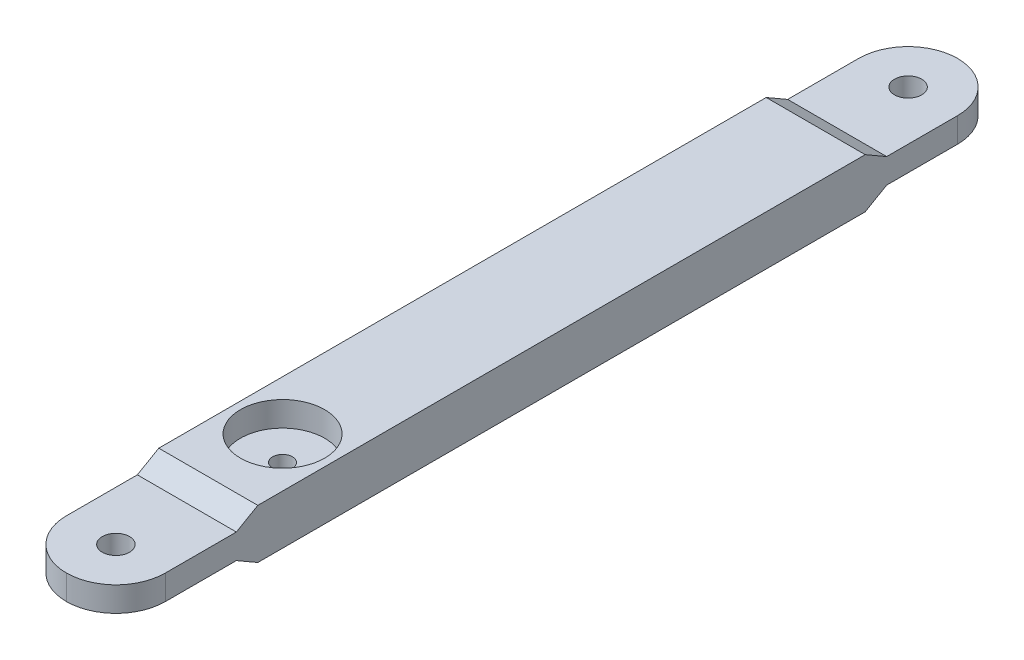
ISO-10303-21;
HEADER;
FILE_DESCRIPTION(('STEP AP214'),'2;1');
FILE_NAME('part.step','',(''),(''),'','','');
FILE_SCHEMA(('AUTOMOTIVE_DESIGN { 1 0 10303 214 1 1 1 1 }'));
ENDSEC;
DATA;
#1=APPLICATION_CONTEXT('core data for automotive mechanical design processes');
#2=APPLICATION_PROTOCOL_DEFINITION('international standard','automotive_design',2000,#1);
#3=PRODUCT_CONTEXT('',#1,'mechanical');
#4=PRODUCT('Part','Part','',(#3));
#5=PRODUCT_RELATED_PRODUCT_CATEGORY('part','',(#4));
#6=PRODUCT_DEFINITION_FORMATION('','',#4);
#7=PRODUCT_DEFINITION_CONTEXT('part definition',#1,'design');
#8=PRODUCT_DEFINITION('design','',#6,#7);
#9=PRODUCT_DEFINITION_SHAPE('','',#8);
#10=(LENGTH_UNIT() NAMED_UNIT(*) SI_UNIT(.MILLI.,.METRE.));
#11=(NAMED_UNIT(*) PLANE_ANGLE_UNIT() SI_UNIT($,.RADIAN.));
#12=(NAMED_UNIT(*) SI_UNIT($,.STERADIAN.) SOLID_ANGLE_UNIT());
#13=UNCERTAINTY_MEASURE_WITH_UNIT(LENGTH_MEASURE(1.E-05),#10,'distance_accuracy_value','');
#14=(GEOMETRIC_REPRESENTATION_CONTEXT(3) GLOBAL_UNCERTAINTY_ASSIGNED_CONTEXT((#13)) GLOBAL_UNIT_ASSIGNED_CONTEXT((#10,
#11,#12)) REPRESENTATION_CONTEXT('',''));
#15=CARTESIAN_POINT('',(0.,0.,0.));
#16=DIRECTION('',(0.,0.,1.));
#17=DIRECTION('',(1.,0.,0.));
#18=AXIS2_PLACEMENT_3D('',#15,#16,#17);
#19=CARTESIAN_POINT('',(-10.,-5.,-70.));
#20=DIRECTION('',(-1.,0.,0.));
#21=DIRECTION('',(0.,0.,1.));
#22=AXIS2_PLACEMENT_3D('',#19,#20,#21);
#23=PLANE('',#22);
#24=DIRECTION('',(0.,0.,-1.));
#25=VECTOR('',#24,1.);
#26=CARTESIAN_POINT('',(-10.,2.5,90.));
#27=LINE('',#26,#25);
#28=CARTESIAN_POINT('',(-10.,2.5,80.));
#29=VERTEX_POINT('',#28);
#30=CARTESIAN_POINT('',(-10.,2.5,65.6698729810777));
#31=VERTEX_POINT('',#30);
#32=EDGE_CURVE('E318',#29,#31,#27,.T.);
#33=ORIENTED_EDGE('',*,*,#32,.T.);
#34=DIRECTION('',(0.,0.499999999999997,-0.866025403784441));
#35=VECTOR('',#34,1.);
#36=CARTESIAN_POINT('',(-10.,59.3717782649104,-32.8349364905394));
#37=LINE('',#36,#35);
#38=CARTESIAN_POINT('',(-10.,5.,61.3397459621554));
#39=VERTEX_POINT('',#38);
#40=EDGE_CURVE('E231',#31,#39,#37,.T.);
#41=ORIENTED_EDGE('',*,*,#40,.T.);
#42=DIRECTION('',(0.,0.,1.));
#43=VECTOR('',#42,1.);
#44=CARTESIAN_POINT('',(-10.,5.,-70.));
#45=LINE('',#44,#43);
#46=CARTESIAN_POINT('',(-10.,5.,-61.3397459621554));
#47=VERTEX_POINT('',#46);
#48=EDGE_CURVE('E168',#47,#39,#45,.T.);
#49=ORIENTED_EDGE('',*,*,#48,.F.);
#50=DIRECTION('',(0.,0.499999999999997,0.866025403784441));
#51=VECTOR('',#50,1.);
#52=CARTESIAN_POINT('',(-10.,-1.25000000000003,-72.1650635094611));
#53=LINE('',#52,#51);
#54=CARTESIAN_POINT('',(-10.,2.5,-65.6698729810777));
#55=VERTEX_POINT('',#54);
#56=EDGE_CURVE('E210',#47,#55,#53,.F.);
#57=ORIENTED_EDGE('',*,*,#56,.T.);
#58=DIRECTION('',(0.,0.,1.));
#59=VECTOR('',#58,1.);
#60=CARTESIAN_POINT('',(-10.,2.5,-90.));
#61=LINE('',#60,#59);
#62=CARTESIAN_POINT('',(-10.,2.5,-80.));
#63=VERTEX_POINT('',#62);
#64=EDGE_CURVE('E160',#63,#55,#61,.T.);
#65=ORIENTED_EDGE('',*,*,#64,.F.);
#66=DIRECTION('',(0.,1.,0.));
#67=VECTOR('',#66,1.);
#68=CARTESIAN_POINT('',(-10.,-5.,-80.));
#69=LINE('',#68,#67);
#70=CARTESIAN_POINT('',(-10.,-2.5,-80.));
#71=VERTEX_POINT('',#70);
#72=EDGE_CURVE('E172',#63,#71,#69,.F.);
#73=ORIENTED_EDGE('',*,*,#72,.T.);
#74=DIRECTION('',(0.,0.,1.));
#75=VECTOR('',#74,1.);
#76=CARTESIAN_POINT('',(-10.,-2.5,-90.));
#77=LINE('',#76,#75);
#78=CARTESIAN_POINT('',(-10.,-2.5,-65.6698729810777));
#79=VERTEX_POINT('',#78);
#80=EDGE_CURVE('E274',#71,#79,#77,.T.);
#81=ORIENTED_EDGE('',*,*,#80,.T.);
#82=DIRECTION('',(0.,0.499999999999997,-0.866025403784441));
#83=VECTOR('',#82,1.);
#84=CARTESIAN_POINT('',(-10.,-1.24999999999994,-67.8349364905389));
#85=LINE('',#84,#83);
#86=CARTESIAN_POINT('',(-10.,-5.,-61.3397459621554));
#87=VERTEX_POINT('',#86);
#88=EDGE_CURVE('E224',#79,#87,#85,.F.);
#89=ORIENTED_EDGE('',*,*,#88,.T.);
#90=DIRECTION('',(0.,0.,1.));
#91=VECTOR('',#90,1.);
#92=CARTESIAN_POINT('',(-10.,-5.,-70.));
#93=LINE('',#92,#91);
#94=CARTESIAN_POINT('',(-10.,-5.,61.3397459621554));
#95=VERTEX_POINT('',#94);
#96=EDGE_CURVE('E178',#87,#95,#93,.T.);
#97=ORIENTED_EDGE('',*,*,#96,.T.);
#98=DIRECTION('',(0.,0.499999999999997,0.866025403784441));
#99=VECTOR('',#98,1.);
#100=CARTESIAN_POINT('',(-10.,-61.8717782649104,-37.1650635094616));
#101=LINE('',#100,#99);
#102=CARTESIAN_POINT('',(-10.,-2.5,65.6698729810777));
#103=VERTEX_POINT('',#102);
#104=EDGE_CURVE('E227',#95,#103,#101,.T.);
#105=ORIENTED_EDGE('',*,*,#104,.T.);
#106=DIRECTION('',(0.,0.,-1.));
#107=VECTOR('',#106,1.);
#108=CARTESIAN_POINT('',(-10.,-2.5,90.));
#109=LINE('',#108,#107);
#110=CARTESIAN_POINT('',(-10.,-2.5,80.));
#111=VERTEX_POINT('',#110);
#112=EDGE_CURVE('E321',#111,#103,#109,.T.);
#113=ORIENTED_EDGE('',*,*,#112,.F.);
#114=DIRECTION('',(0.,1.,0.));
#115=VECTOR('',#114,1.);
#116=CARTESIAN_POINT('',(-10.,-5.,80.));
#117=LINE('',#116,#115);
#118=EDGE_CURVE('E149',#111,#29,#117,.T.);
#119=ORIENTED_EDGE('',*,*,#118,.T.);
#120=EDGE_LOOP('',(#33,#41,#49,#57,#65,#73,#81,#89,#97,#105,#113,#119));
#121=FACE_BOUND('',#120,.T.);
#122=ADVANCED_FACE('F38',(#121),#23,.T.);
#123=CARTESIAN_POINT('',(-10.,5.,-70.));
#124=DIRECTION('',(0.,1.,0.));
#125=DIRECTION('',(0.,0.,1.));
#126=AXIS2_PLACEMENT_3D('',#123,#124,#125);
#127=PLANE('',#126);
#128=CARTESIAN_POINT('',(0.,5.,46.3397459621554));
#129=DIRECTION('',(0.,1.,0.));
#130=DIRECTION('',(0.,0.,1.));
#131=AXIS2_PLACEMENT_3D('',#128,#129,#130);
#132=CIRCLE('',#131,8.5);
#133=CARTESIAN_POINT('',(0.,5.,54.8397459621554));
#134=VERTEX_POINT('',#133);
#135=EDGE_CURVE('E330',#134,#134,#132,.T.);
#136=ORIENTED_EDGE('',*,*,#135,.F.);
#137=EDGE_LOOP('',(#136));
#138=FACE_BOUND('',#137,.T.);
#139=ORIENTED_EDGE('',*,*,#48,.T.);
#140=DIRECTION('',(1.,0.,0.));
#141=VECTOR('',#140,1.);
#142=CARTESIAN_POINT('',(10.,5.,61.3397459621554));
#143=LINE('',#142,#141);
#144=CARTESIAN_POINT('',(10.,5.,61.3397459621554));
#145=VERTEX_POINT('',#144);
#146=EDGE_CURVE('E238',#39,#145,#143,.T.);
#147=ORIENTED_EDGE('',*,*,#146,.T.);
#148=DIRECTION('',(0.,0.,1.));
#149=VECTOR('',#148,1.);
#150=CARTESIAN_POINT('',(10.,5.,-70.));
#151=LINE('',#150,#149);
#152=CARTESIAN_POINT('',(10.,5.,-61.3397459621554));
#153=VERTEX_POINT('',#152);
#154=EDGE_CURVE('E175',#153,#145,#151,.T.);
#155=ORIENTED_EDGE('',*,*,#154,.F.);
#156=DIRECTION('',(-1.,0.,0.));
#157=VECTOR('',#156,1.);
#158=CARTESIAN_POINT('',(-10.,5.,-61.3397459621554));
#159=LINE('',#158,#157);
#160=EDGE_CURVE('E234',#153,#47,#159,.T.);
#161=ORIENTED_EDGE('',*,*,#160,.T.);
#162=EDGE_LOOP('',(#139,#147,#155,#161));
#163=FACE_BOUND('',#162,.T.);
#164=ADVANCED_FACE('F301',(#138,#163),#127,.T.);
#165=CARTESIAN_POINT('',(10.,-5.,-70.));
#166=DIRECTION('',(1.,0.,0.));
#167=DIRECTION('',(0.,0.,-1.));
#168=AXIS2_PLACEMENT_3D('',#165,#166,#167);
#169=PLANE('',#168);
#170=DIRECTION('',(0.,-0.499999999999997,0.866025403784441));
#171=VECTOR('',#170,1.);
#172=CARTESIAN_POINT('',(10.,59.3717782649104,-32.8349364905394));
#173=LINE('',#172,#171);
#174=CARTESIAN_POINT('',(10.,2.5,65.6698729810777));
#175=VERTEX_POINT('',#174);
#176=EDGE_CURVE('E251',#145,#175,#173,.T.);
#177=ORIENTED_EDGE('',*,*,#176,.T.);
#178=DIRECTION('',(0.,0.,-1.));
#179=VECTOR('',#178,1.);
#180=CARTESIAN_POINT('',(10.,2.5,90.));
#181=LINE('',#180,#179);
#182=CARTESIAN_POINT('',(10.,2.5,80.));
#183=VERTEX_POINT('',#182);
#184=EDGE_CURVE('E57',#183,#175,#181,.T.);
#185=ORIENTED_EDGE('',*,*,#184,.F.);
#186=DIRECTION('',(0.,-1.,0.));
#187=VECTOR('',#186,1.);
#188=CARTESIAN_POINT('',(10.,-5.,80.));
#189=LINE('',#188,#187);
#190=CARTESIAN_POINT('',(10.,-2.5,80.));
#191=VERTEX_POINT('',#190);
#192=EDGE_CURVE('E207',#183,#191,#189,.T.);
#193=ORIENTED_EDGE('',*,*,#192,.T.);
#194=DIRECTION('',(0.,0.,-1.));
#195=VECTOR('',#194,1.);
#196=CARTESIAN_POINT('',(10.,-2.5,90.));
#197=LINE('',#196,#195);
#198=CARTESIAN_POINT('',(10.,-2.5,65.6698729810777));
#199=VERTEX_POINT('',#198);
#200=EDGE_CURVE('E215',#191,#199,#197,.T.);
#201=ORIENTED_EDGE('',*,*,#200,.T.);
#202=DIRECTION('',(0.,-0.499999999999997,-0.866025403784441));
#203=VECTOR('',#202,1.);
#204=CARTESIAN_POINT('',(10.,-61.8717782649104,-37.1650635094616));
#205=LINE('',#204,#203);
#206=CARTESIAN_POINT('',(10.,-5.,61.3397459621554));
#207=VERTEX_POINT('',#206);
#208=EDGE_CURVE('E248',#199,#207,#205,.T.);
#209=ORIENTED_EDGE('',*,*,#208,.T.);
#210=DIRECTION('',(0.,0.,1.));
#211=VECTOR('',#210,1.);
#212=CARTESIAN_POINT('',(10.,-5.,-70.));
#213=LINE('',#212,#211);
#214=CARTESIAN_POINT('',(10.,-5.,-61.3397459621554));
#215=VERTEX_POINT('',#214);
#216=EDGE_CURVE('E287',#215,#207,#213,.T.);
#217=ORIENTED_EDGE('',*,*,#216,.F.);
#218=DIRECTION('',(0.,-0.499999999999997,0.866025403784441));
#219=VECTOR('',#218,1.);
#220=CARTESIAN_POINT('',(10.,-1.24999999999994,-67.8349364905389));
#221=LINE('',#220,#219);
#222=CARTESIAN_POINT('',(10.,-2.5,-65.6698729810777));
#223=VERTEX_POINT('',#222);
#224=EDGE_CURVE('E245',#215,#223,#221,.F.);
#225=ORIENTED_EDGE('',*,*,#224,.T.);
#226=DIRECTION('',(0.,0.,1.));
#227=VECTOR('',#226,1.);
#228=CARTESIAN_POINT('',(10.,-2.5,-90.));
#229=LINE('',#228,#227);
#230=CARTESIAN_POINT('',(10.,-2.5,-80.));
#231=VERTEX_POINT('',#230);
#232=EDGE_CURVE('E74',#231,#223,#229,.T.);
#233=ORIENTED_EDGE('',*,*,#232,.F.);
#234=DIRECTION('',(0.,-1.,0.));
#235=VECTOR('',#234,1.);
#236=CARTESIAN_POINT('',(10.,-5.,-80.));
#237=LINE('',#236,#235);
#238=CARTESIAN_POINT('',(10.,2.5,-80.));
#239=VERTEX_POINT('',#238);
#240=EDGE_CURVE('E143',#231,#239,#237,.F.);
#241=ORIENTED_EDGE('',*,*,#240,.T.);
#242=DIRECTION('',(0.,0.,1.));
#243=VECTOR('',#242,1.);
#244=CARTESIAN_POINT('',(10.,2.5,-90.));
#245=LINE('',#244,#243);
#246=CARTESIAN_POINT('',(10.,2.5,-65.6698729810777));
#247=VERTEX_POINT('',#246);
#248=EDGE_CURVE('E82',#239,#247,#245,.T.);
#249=ORIENTED_EDGE('',*,*,#248,.T.);
#250=DIRECTION('',(0.,-0.499999999999997,-0.866025403784441));
#251=VECTOR('',#250,1.);
#252=CARTESIAN_POINT('',(10.,-1.25000000000003,-72.1650635094611));
#253=LINE('',#252,#251);
#254=EDGE_CURVE('E242',#247,#153,#253,.F.);
#255=ORIENTED_EDGE('',*,*,#254,.T.);
#256=ORIENTED_EDGE('',*,*,#154,.T.);
#257=EDGE_LOOP('',(#177,#185,#193,#201,#209,#217,#225,#233,#241,#249,#255,#256));
#258=FACE_BOUND('',#257,.T.);
#259=ADVANCED_FACE('F144',(#258),#169,.T.);
#260=CARTESIAN_POINT('',(-10.,-5.,-70.));
#261=DIRECTION('',(0.,-1.,0.));
#262=DIRECTION('',(0.,0.,-1.));
#263=AXIS2_PLACEMENT_3D('',#260,#261,#262);
#264=PLANE('',#263);
#265=CARTESIAN_POINT('',(0.,-5.,46.3397459621554));
#266=DIRECTION('',(0.,1.,0.));
#267=DIRECTION('',(0.,0.,1.));
#268=AXIS2_PLACEMENT_3D('',#265,#266,#267);
#269=CIRCLE('',#268,2.);
#270=CARTESIAN_POINT('',(0.,-5.,48.3397459621554));
#271=VERTEX_POINT('',#270);
#272=EDGE_CURVE('E337',#271,#271,#269,.T.);
#273=ORIENTED_EDGE('',*,*,#272,.T.);
#274=EDGE_LOOP('',(#273));
#275=FACE_BOUND('',#274,.T.);
#276=ORIENTED_EDGE('',*,*,#216,.T.);
#277=DIRECTION('',(-1.,0.,0.));
#278=VECTOR('',#277,1.);
#279=CARTESIAN_POINT('',(-10.,-5.,61.3397459621554));
#280=LINE('',#279,#278);
#281=EDGE_CURVE('E258',#207,#95,#280,.T.);
#282=ORIENTED_EDGE('',*,*,#281,.T.);
#283=ORIENTED_EDGE('',*,*,#96,.F.);
#284=DIRECTION('',(1.,0.,0.));
#285=VECTOR('',#284,1.);
#286=CARTESIAN_POINT('',(-10.,-5.,-61.3397459621554));
#287=LINE('',#286,#285);
#288=EDGE_CURVE('E254',#87,#215,#287,.T.);
#289=ORIENTED_EDGE('',*,*,#288,.T.);
#290=EDGE_LOOP('',(#276,#282,#283,#289));
#291=FACE_BOUND('',#290,.T.);
#292=ADVANCED_FACE('F283',(#275,#291),#264,.T.);
#293=CARTESIAN_POINT('',(10.,-2.5,-90.));
#294=DIRECTION('',(0.,1.,0.));
#295=DIRECTION('',(0.,0.,1.));
#296=AXIS2_PLACEMENT_3D('',#293,#294,#295);
#297=PLANE('',#296);
#298=CARTESIAN_POINT('',(0.,-2.5,-80.));
#299=DIRECTION('',(0.,1.,0.));
#300=DIRECTION('',(0.,0.,1.));
#301=AXIS2_PLACEMENT_3D('',#298,#299,#300);
#302=CIRCLE('',#301,2.75);
#303=CARTESIAN_POINT('',(0.,-2.5,-77.25));
#304=VERTEX_POINT('',#303);
#305=EDGE_CURVE('E191',#304,#304,#302,.T.);
#306=ORIENTED_EDGE('',*,*,#305,.T.);
#307=EDGE_LOOP('',(#306));
#308=FACE_BOUND('',#307,.T.);
#309=ORIENTED_EDGE('',*,*,#80,.F.);
#310=CARTESIAN_POINT('',(0.,-2.5,-80.));
#311=DIRECTION('',(0.,1.,0.));
#312=DIRECTION('',(0.,0.,1.));
#313=AXIS2_PLACEMENT_3D('',#310,#311,#312);
#314=CIRCLE('',#313,10.);
#315=CARTESIAN_POINT('',(0.,-2.5,-90.));
#316=VERTEX_POINT('',#315);
#317=EDGE_CURVE('E150',#71,#316,#314,.F.);
#318=ORIENTED_EDGE('',*,*,#317,.T.);
#319=CARTESIAN_POINT('',(0.,-2.5,-80.));
#320=DIRECTION('',(0.,1.,0.));
#321=DIRECTION('',(0.,0.,1.));
#322=AXIS2_PLACEMENT_3D('',#319,#320,#321);
#323=CIRCLE('',#322,10.);
#324=EDGE_CURVE('E184',#316,#231,#323,.F.);
#325=ORIENTED_EDGE('',*,*,#324,.T.);
#326=ORIENTED_EDGE('',*,*,#232,.T.);
#327=DIRECTION('',(1.,0.,0.));
#328=VECTOR('',#327,1.);
#329=CARTESIAN_POINT('',(10.,-2.5,-65.6698729810777));
#330=LINE('',#329,#328);
#331=EDGE_CURVE('E49',#223,#79,#330,.F.);
#332=ORIENTED_EDGE('',*,*,#331,.T.);
#333=EDGE_LOOP('',(#309,#318,#325,#326,#332));
#334=FACE_BOUND('',#333,.T.);
#335=ADVANCED_FACE('F273',(#308,#334),#297,.F.);
#336=CARTESIAN_POINT('',(10.,2.5,-90.));
#337=DIRECTION('',(0.,-1.,0.));
#338=DIRECTION('',(0.,0.,-1.));
#339=AXIS2_PLACEMENT_3D('',#336,#337,#338);
#340=PLANE('',#339);
#341=CARTESIAN_POINT('',(0.,2.5,-80.));
#342=DIRECTION('',(0.,1.,0.));
#343=DIRECTION('',(0.,0.,1.));
#344=AXIS2_PLACEMENT_3D('',#341,#342,#343);
#345=CIRCLE('',#344,2.75);
#346=CARTESIAN_POINT('',(0.,2.5,-77.25));
#347=VERTEX_POINT('',#346);
#348=EDGE_CURVE('E312',#347,#347,#345,.T.);
#349=ORIENTED_EDGE('',*,*,#348,.F.);
#350=EDGE_LOOP('',(#349));
#351=FACE_BOUND('',#350,.T.);
#352=CARTESIAN_POINT('',(0.,2.5,-80.));
#353=DIRECTION('',(0.,-1.,0.));
#354=DIRECTION('',(0.,0.,-1.));
#355=AXIS2_PLACEMENT_3D('',#352,#353,#354);
#356=CIRCLE('',#355,10.);
#357=CARTESIAN_POINT('',(0.,2.5,-90.));
#358=VERTEX_POINT('',#357);
#359=EDGE_CURVE('E154',#239,#358,#356,.F.);
#360=ORIENTED_EDGE('',*,*,#359,.T.);
#361=CARTESIAN_POINT('',(0.,2.5,-80.));
#362=DIRECTION('',(0.,-1.,0.));
#363=DIRECTION('',(0.,0.,-1.));
#364=AXIS2_PLACEMENT_3D('',#361,#362,#363);
#365=CIRCLE('',#364,10.);
#366=EDGE_CURVE('E167',#358,#63,#365,.F.);
#367=ORIENTED_EDGE('',*,*,#366,.T.);
#368=ORIENTED_EDGE('',*,*,#64,.T.);
#369=DIRECTION('',(-1.,0.,0.));
#370=VECTOR('',#369,1.);
#371=CARTESIAN_POINT('',(10.,2.5,-65.6698729810777));
#372=LINE('',#371,#370);
#373=EDGE_CURVE('E11',#55,#247,#372,.F.);
#374=ORIENTED_EDGE('',*,*,#373,.T.);
#375=ORIENTED_EDGE('',*,*,#248,.F.);
#376=EDGE_LOOP('',(#360,#367,#368,#374,#375));
#377=FACE_BOUND('',#376,.T.);
#378=ADVANCED_FACE('F153',(#351,#377),#340,.F.);
#379=CARTESIAN_POINT('',(0.,0.,-80.));
#380=DIRECTION('',(0.,-1.,0.));
#381=DIRECTION('',(0.,0.,-1.));
#382=AXIS2_PLACEMENT_3D('',#379,#380,#381);
#383=CYLINDRICAL_SURFACE('',#382,10.);
#384=ORIENTED_EDGE('',*,*,#240,.F.);
#385=ORIENTED_EDGE('',*,*,#324,.F.);
#386=DIRECTION('',(0.,-1.,0.));
#387=VECTOR('',#386,1.);
#388=CARTESIAN_POINT('',(0.,0.,-90.));
#389=LINE('',#388,#387);
#390=EDGE_CURVE('E161',#358,#316,#389,.T.);
#391=ORIENTED_EDGE('',*,*,#390,.F.);
#392=ORIENTED_EDGE('',*,*,#359,.F.);
#393=EDGE_LOOP('',(#384,#385,#391,#392));
#394=FACE_BOUND('',#393,.T.);
#395=ADVANCED_FACE('F163',(#394),#383,.T.);
#396=CARTESIAN_POINT('',(0.,0.,-80.));
#397=DIRECTION('',(0.,1.,0.));
#398=DIRECTION('',(0.,0.,1.));
#399=AXIS2_PLACEMENT_3D('',#396,#397,#398);
#400=CYLINDRICAL_SURFACE('',#399,10.);
#401=ORIENTED_EDGE('',*,*,#317,.F.);
#402=ORIENTED_EDGE('',*,*,#72,.F.);
#403=ORIENTED_EDGE('',*,*,#366,.F.);
#404=ORIENTED_EDGE('',*,*,#390,.T.);
#405=EDGE_LOOP('',(#401,#402,#403,#404));
#406=FACE_BOUND('',#405,.T.);
#407=ADVANCED_FACE('F376',(#406),#400,.T.);
#408=CARTESIAN_POINT('',(0.,-5.,-80.));
#409=DIRECTION('',(0.,1.,0.));
#410=DIRECTION('',(0.,0.,1.));
#411=AXIS2_PLACEMENT_3D('',#408,#409,#410);
#412=CYLINDRICAL_SURFACE('',#411,2.75);
#413=CARTESIAN_POINT('',(0.,2.5,-77.25));
#414=CARTESIAN_POINT('',(0.,2.44791666666667,-77.25));
#415=CARTESIAN_POINT('',(0.,2.39583333333333,-77.25));
#416=CARTESIAN_POINT('',(0.,2.29166666666667,-77.25));
#417=CARTESIAN_POINT('',(0.,2.23958333333333,-77.25));
#418=CARTESIAN_POINT('',(0.,2.13541666666667,-77.25));
#419=CARTESIAN_POINT('',(0.,2.08333333333333,-77.25));
#420=CARTESIAN_POINT('',(0.,1.97916666666667,-77.25));
#421=CARTESIAN_POINT('',(0.,1.92708333333333,-77.25));
#422=CARTESIAN_POINT('',(0.,1.82291666666667,-77.25));
#423=CARTESIAN_POINT('',(0.,1.77083333333333,-77.25));
#424=CARTESIAN_POINT('',(0.,1.66666666666667,-77.25));
#425=CARTESIAN_POINT('',(0.,1.61458333333333,-77.25));
#426=CARTESIAN_POINT('',(0.,1.51041666666667,-77.25));
#427=CARTESIAN_POINT('',(0.,1.45833333333333,-77.25));
#428=CARTESIAN_POINT('',(0.,1.35416666666667,-77.25));
#429=CARTESIAN_POINT('',(0.,1.30208333333333,-77.25));
#430=CARTESIAN_POINT('',(0.,1.19791666666667,-77.25));
#431=CARTESIAN_POINT('',(0.,1.14583333333333,-77.25));
#432=CARTESIAN_POINT('',(0.,1.04166666666667,-77.25));
#433=CARTESIAN_POINT('',(0.,0.989583333333333,-77.25));
#434=CARTESIAN_POINT('',(0.,0.885416666666667,-77.25));
#435=CARTESIAN_POINT('',(0.,0.833333333333333,-77.25));
#436=CARTESIAN_POINT('',(0.,0.729166666666667,-77.25));
#437=CARTESIAN_POINT('',(0.,0.677083333333333,-77.25));
#438=CARTESIAN_POINT('',(0.,0.572916666666666,-77.25));
#439=CARTESIAN_POINT('',(0.,0.520833333333333,-77.25));
#440=CARTESIAN_POINT('',(0.,0.416666666666666,-77.25));
#441=CARTESIAN_POINT('',(0.,0.364583333333333,-77.25));
#442=CARTESIAN_POINT('',(0.,0.260416666666667,-77.25));
#443=CARTESIAN_POINT('',(0.,0.208333333333334,-77.25));
#444=CARTESIAN_POINT('',(0.,0.104166666666667,-77.25));
#445=CARTESIAN_POINT('',(0.,0.0520833333333334,-77.25));
#446=CARTESIAN_POINT('',(0.,-0.0520833333333334,-77.25));
#447=CARTESIAN_POINT('',(0.,-0.104166666666667,-77.25));
#448=CARTESIAN_POINT('',(0.,-0.208333333333334,-77.25));
#449=CARTESIAN_POINT('',(0.,-0.260416666666667,-77.25));
#450=CARTESIAN_POINT('',(0.,-0.364583333333334,-77.25));
#451=CARTESIAN_POINT('',(0.,-0.416666666666667,-77.25));
#452=CARTESIAN_POINT('',(0.,-0.520833333333334,-77.25));
#453=CARTESIAN_POINT('',(0.,-0.572916666666667,-77.25));
#454=CARTESIAN_POINT('',(0.,-0.677083333333334,-77.25));
#455=CARTESIAN_POINT('',(0.,-0.729166666666667,-77.25));
#456=CARTESIAN_POINT('',(0.,-0.833333333333334,-77.25));
#457=CARTESIAN_POINT('',(0.,-0.885416666666668,-77.25));
#458=CARTESIAN_POINT('',(0.,-0.989583333333334,-77.25));
#459=CARTESIAN_POINT('',(0.,-1.04166666666667,-77.25));
#460=CARTESIAN_POINT('',(0.,-1.14583333333333,-77.25));
#461=CARTESIAN_POINT('',(0.,-1.19791666666667,-77.25));
#462=CARTESIAN_POINT('',(0.,-1.30208333333333,-77.25));
#463=CARTESIAN_POINT('',(0.,-1.35416666666667,-77.25));
#464=CARTESIAN_POINT('',(0.,-1.45833333333333,-77.25));
#465=CARTESIAN_POINT('',(0.,-1.51041666666667,-77.25));
#466=CARTESIAN_POINT('',(0.,-1.61458333333333,-77.25));
#467=CARTESIAN_POINT('',(0.,-1.66666666666667,-77.25));
#468=CARTESIAN_POINT('',(0.,-1.77083333333333,-77.25));
#469=CARTESIAN_POINT('',(0.,-1.82291666666667,-77.25));
#470=CARTESIAN_POINT('',(0.,-1.92708333333333,-77.25));
#471=CARTESIAN_POINT('',(0.,-1.97916666666667,-77.25));
#472=CARTESIAN_POINT('',(0.,-2.08333333333333,-77.25));
#473=CARTESIAN_POINT('',(0.,-2.13541666666667,-77.25));
#474=CARTESIAN_POINT('',(0.,-2.23958333333333,-77.25));
#475=CARTESIAN_POINT('',(0.,-2.29166666666667,-77.25));
#476=CARTESIAN_POINT('',(0.,-2.39583333333333,-77.25));
#477=CARTESIAN_POINT('',(0.,-2.44791666666667,-77.25));
#478=CARTESIAN_POINT('',(0.,-2.5,-77.25));
#479=B_SPLINE_CURVE_WITH_KNOTS('',3,(#413,#414,#415,#416,#417,#418,#419,#420,#421,#422,#423,
#424,#425,#426,#427,#428,#429,#430,#431,#432,#433,#434,#435,#436,#437,#438,#439,#440,#441,#442,
#443,#444,#445,#446,#447,#448,#449,#450,#451,#452,#453,#454,#455,#456,#457,#458,#459,#460,#461,
#462,#463,#464,#465,#466,#467,#468,#469,#470,#471,#472,#473,#474,#475,#476,#477,#478),
.UNSPECIFIED.,.F.,.F.,(4,2,2,2,2,2,2,2,2,2,2,2,2,2,2,2,2,2,2,2,2,2,2,2,2,2,2,2,2,2,2,2,4),(0.,
0.15625,0.3125,0.46875,0.625000000000001,0.781250000000001,0.937500000000001,1.09375,1.25,
1.40625,1.5625,1.71875,1.875,2.03125,2.1875,2.34375,2.5,2.65625,2.8125,2.96875,3.125,3.28125,
3.4375,3.59375,3.75,3.90625,4.0625,4.21875,4.375,4.53125,4.6875,4.84375,5.),.UNSPECIFIED.);
#480=EDGE_CURVE('BSEAM379',#347,#304,#479,.T.);
#481=ORIENTED_EDGE('',*,*,#348,.T.);
#482=ORIENTED_EDGE('',*,*,#305,.F.);
#483=ORIENTED_EDGE('',*,*,#480,.T.);
#484=ORIENTED_EDGE('',*,*,#480,.F.);
#485=EDGE_LOOP('',(#481,#483,#482,#484));
#486=FACE_BOUND('',#485,.T.);
#487=ADVANCED_FACE('F379',(#486),#412,.F.);
#488=CARTESIAN_POINT('',(10.,2.5,90.));
#489=DIRECTION('',(0.,1.,0.));
#490=DIRECTION('',(0.,0.,1.));
#491=AXIS2_PLACEMENT_3D('',#488,#489,#490);
#492=PLANE('',#491);
#493=CARTESIAN_POINT('',(0.,2.5,80.));
#494=DIRECTION('',(0.,-1.,0.));
#495=DIRECTION('',(0.,0.,-1.));
#496=AXIS2_PLACEMENT_3D('',#493,#494,#495);
#497=CIRCLE('',#496,2.75);
#498=CARTESIAN_POINT('',(0.,2.5,82.75));
#499=VERTEX_POINT('',#498);
#500=EDGE_CURVE('E220',#499,#499,#497,.T.);
#501=ORIENTED_EDGE('',*,*,#500,.T.);
#502=EDGE_LOOP('',(#501));
#503=FACE_BOUND('',#502,.T.);
#504=ORIENTED_EDGE('',*,*,#32,.F.);
#505=CARTESIAN_POINT('',(0.,2.5,80.));
#506=DIRECTION('',(0.,1.,0.));
#507=DIRECTION('',(0.,0.,1.));
#508=AXIS2_PLACEMENT_3D('',#505,#506,#507);
#509=CIRCLE('',#508,10.);
#510=CARTESIAN_POINT('',(0.,2.5,90.));
#511=VERTEX_POINT('',#510);
#512=EDGE_CURVE('E198',#29,#511,#509,.T.);
#513=ORIENTED_EDGE('',*,*,#512,.T.);
#514=CARTESIAN_POINT('',(0.,2.5,80.));
#515=DIRECTION('',(0.,1.,0.));
#516=DIRECTION('',(0.,0.,1.));
#517=AXIS2_PLACEMENT_3D('',#514,#515,#516);
#518=CIRCLE('',#517,10.);
#519=EDGE_CURVE('E195',#511,#183,#518,.T.);
#520=ORIENTED_EDGE('',*,*,#519,.T.);
#521=ORIENTED_EDGE('',*,*,#184,.T.);
#522=DIRECTION('',(-1.,0.,0.));
#523=VECTOR('',#522,1.);
#524=CARTESIAN_POINT('',(0.,2.5,65.6698729810777));
#525=LINE('',#524,#523);
#526=EDGE_CURVE('E262',#175,#31,#525,.T.);
#527=ORIENTED_EDGE('',*,*,#526,.T.);
#528=EDGE_LOOP('',(#504,#513,#520,#521,#527));
#529=FACE_BOUND('',#528,.T.);
#530=ADVANCED_FACE('F468',(#503,#529),#492,.T.);
#531=CARTESIAN_POINT('',(10.,-2.5,90.));
#532=DIRECTION('',(0.,-1.,0.));
#533=DIRECTION('',(0.,0.,-1.));
#534=AXIS2_PLACEMENT_3D('',#531,#532,#533);
#535=PLANE('',#534);
#536=CARTESIAN_POINT('',(0.,-2.5,80.));
#537=DIRECTION('',(0.,-1.,0.));
#538=DIRECTION('',(0.,0.,-1.));
#539=AXIS2_PLACEMENT_3D('',#536,#537,#538);
#540=CIRCLE('',#539,2.75);
#541=CARTESIAN_POINT('',(0.,-2.5,82.75));
#542=VERTEX_POINT('',#541);
#543=EDGE_CURVE('E216',#542,#542,#540,.F.);
#544=ORIENTED_EDGE('',*,*,#543,.T.);
#545=EDGE_LOOP('',(#544));
#546=FACE_BOUND('',#545,.T.);
#547=CARTESIAN_POINT('',(0.,-2.5,80.));
#548=DIRECTION('',(0.,-1.,0.));
#549=DIRECTION('',(0.,0.,-1.));
#550=AXIS2_PLACEMENT_3D('',#547,#548,#549);
#551=CIRCLE('',#550,10.);
#552=CARTESIAN_POINT('',(0.,-2.5,90.));
#553=VERTEX_POINT('',#552);
#554=EDGE_CURVE('E201',#191,#553,#551,.T.);
#555=ORIENTED_EDGE('',*,*,#554,.T.);
#556=CARTESIAN_POINT('',(0.,-2.5,80.));
#557=DIRECTION('',(0.,-1.,0.));
#558=DIRECTION('',(0.,0.,-1.));
#559=AXIS2_PLACEMENT_3D('',#556,#557,#558);
#560=CIRCLE('',#559,10.);
#561=EDGE_CURVE('E204',#553,#111,#560,.T.);
#562=ORIENTED_EDGE('',*,*,#561,.T.);
#563=ORIENTED_EDGE('',*,*,#112,.T.);
#564=DIRECTION('',(1.,0.,0.));
#565=VECTOR('',#564,1.);
#566=CARTESIAN_POINT('',(0.,-2.5,65.6698729810777));
#567=LINE('',#566,#565);
#568=EDGE_CURVE('E265',#103,#199,#567,.T.);
#569=ORIENTED_EDGE('',*,*,#568,.T.);
#570=ORIENTED_EDGE('',*,*,#200,.F.);
#571=EDGE_LOOP('',(#555,#562,#563,#569,#570));
#572=FACE_BOUND('',#571,.T.);
#573=ADVANCED_FACE('F391',(#546,#572),#535,.T.);
#574=CARTESIAN_POINT('',(0.,-5.,80.));
#575=DIRECTION('',(0.,-1.,0.));
#576=DIRECTION('',(0.,0.,-1.));
#577=AXIS2_PLACEMENT_3D('',#574,#575,#576);
#578=CYLINDRICAL_SURFACE('',#577,10.);
#579=DIRECTION('',(0.,-1.,0.));
#580=VECTOR('',#579,1.);
#581=CARTESIAN_POINT('',(0.,0.,90.));
#582=LINE('',#581,#580);
#583=EDGE_CURVE('E211',#553,#511,#582,.F.);
#584=ORIENTED_EDGE('',*,*,#583,.F.);
#585=ORIENTED_EDGE('',*,*,#554,.F.);
#586=ORIENTED_EDGE('',*,*,#192,.F.);
#587=ORIENTED_EDGE('',*,*,#519,.F.);
#588=EDGE_LOOP('',(#584,#585,#586,#587));
#589=FACE_BOUND('',#588,.T.);
#590=ADVANCED_FACE('F387',(#589),#578,.T.);
#591=CARTESIAN_POINT('',(0.,-5.,80.));
#592=DIRECTION('',(0.,1.,0.));
#593=DIRECTION('',(0.,0.,1.));
#594=AXIS2_PLACEMENT_3D('',#591,#592,#593);
#595=CYLINDRICAL_SURFACE('',#594,10.);
#596=ORIENTED_EDGE('',*,*,#561,.F.);
#597=ORIENTED_EDGE('',*,*,#583,.T.);
#598=ORIENTED_EDGE('',*,*,#512,.F.);
#599=ORIENTED_EDGE('',*,*,#118,.F.);
#600=EDGE_LOOP('',(#596,#597,#598,#599));
#601=FACE_BOUND('',#600,.T.);
#602=ADVANCED_FACE('F383',(#601),#595,.T.);
#603=CARTESIAN_POINT('',(0.,-5.,80.));
#604=DIRECTION('',(0.,1.,0.));
#605=DIRECTION('',(0.,0.,1.));
#606=AXIS2_PLACEMENT_3D('',#603,#604,#605);
#607=CYLINDRICAL_SURFACE('',#606,2.75);
#608=CARTESIAN_POINT('',(0.,-2.5,82.75));
#609=CARTESIAN_POINT('',(0.,-2.44791666666667,82.75));
#610=CARTESIAN_POINT('',(0.,-2.39583333333333,82.75));
#611=CARTESIAN_POINT('',(0.,-2.29166666666667,82.75));
#612=CARTESIAN_POINT('',(0.,-2.23958333333333,82.75));
#613=CARTESIAN_POINT('',(0.,-2.13541666666667,82.75));
#614=CARTESIAN_POINT('',(0.,-2.08333333333333,82.75));
#615=CARTESIAN_POINT('',(0.,-1.97916666666667,82.75));
#616=CARTESIAN_POINT('',(0.,-1.92708333333333,82.75));
#617=CARTESIAN_POINT('',(0.,-1.82291666666667,82.75));
#618=CARTESIAN_POINT('',(0.,-1.77083333333333,82.75));
#619=CARTESIAN_POINT('',(0.,-1.66666666666667,82.75));
#620=CARTESIAN_POINT('',(0.,-1.61458333333333,82.75));
#621=CARTESIAN_POINT('',(0.,-1.51041666666667,82.75));
#622=CARTESIAN_POINT('',(0.,-1.45833333333333,82.75));
#623=CARTESIAN_POINT('',(0.,-1.35416666666667,82.75));
#624=CARTESIAN_POINT('',(0.,-1.30208333333333,82.75));
#625=CARTESIAN_POINT('',(0.,-1.19791666666667,82.75));
#626=CARTESIAN_POINT('',(0.,-1.14583333333333,82.75));
#627=CARTESIAN_POINT('',(0.,-1.04166666666667,82.75));
#628=CARTESIAN_POINT('',(0.,-0.989583333333333,82.75));
#629=CARTESIAN_POINT('',(0.,-0.885416666666667,82.75));
#630=CARTESIAN_POINT('',(0.,-0.833333333333334,82.75));
#631=CARTESIAN_POINT('',(0.,-0.729166666666667,82.75));
#632=CARTESIAN_POINT('',(0.,-0.677083333333334,82.75));
#633=CARTESIAN_POINT('',(0.,-0.572916666666667,82.75));
#634=CARTESIAN_POINT('',(0.,-0.520833333333334,82.75));
#635=CARTESIAN_POINT('',(0.,-0.416666666666667,82.75));
#636=CARTESIAN_POINT('',(0.,-0.364583333333334,82.75));
#637=CARTESIAN_POINT('',(0.,-0.260416666666667,82.75));
#638=CARTESIAN_POINT('',(0.,-0.208333333333334,82.75));
#639=CARTESIAN_POINT('',(0.,-0.104166666666667,82.75));
#640=CARTESIAN_POINT('',(0.,-0.0520833333333334,82.75));
#641=CARTESIAN_POINT('',(0.,0.0520833333333334,82.75));
#642=CARTESIAN_POINT('',(0.,0.104166666666667,82.75));
#643=CARTESIAN_POINT('',(0.,0.208333333333334,82.75));
#644=CARTESIAN_POINT('',(0.,0.260416666666667,82.75));
#645=CARTESIAN_POINT('',(0.,0.364583333333334,82.75));
#646=CARTESIAN_POINT('',(0.,0.416666666666667,82.75));
#647=CARTESIAN_POINT('',(0.,0.520833333333334,82.75));
#648=CARTESIAN_POINT('',(0.,0.572916666666667,82.75));
#649=CARTESIAN_POINT('',(0.,0.677083333333334,82.75));
#650=CARTESIAN_POINT('',(0.,0.729166666666667,82.75));
#651=CARTESIAN_POINT('',(0.,0.833333333333334,82.75));
#652=CARTESIAN_POINT('',(0.,0.885416666666667,82.75));
#653=CARTESIAN_POINT('',(0.,0.989583333333333,82.75));
#654=CARTESIAN_POINT('',(0.,1.04166666666667,82.75));
#655=CARTESIAN_POINT('',(0.,1.14583333333333,82.75));
#656=CARTESIAN_POINT('',(0.,1.19791666666667,82.75));
#657=CARTESIAN_POINT('',(0.,1.30208333333333,82.75));
#658=CARTESIAN_POINT('',(0.,1.35416666666667,82.75));
#659=CARTESIAN_POINT('',(0.,1.45833333333333,82.75));
#660=CARTESIAN_POINT('',(0.,1.51041666666667,82.75));
#661=CARTESIAN_POINT('',(0.,1.61458333333333,82.75));
#662=CARTESIAN_POINT('',(0.,1.66666666666667,82.75));
#663=CARTESIAN_POINT('',(0.,1.77083333333333,82.75));
#664=CARTESIAN_POINT('',(0.,1.82291666666667,82.75));
#665=CARTESIAN_POINT('',(0.,1.92708333333333,82.75));
#666=CARTESIAN_POINT('',(0.,1.97916666666667,82.75));
#667=CARTESIAN_POINT('',(0.,2.08333333333333,82.75));
#668=CARTESIAN_POINT('',(0.,2.13541666666667,82.75));
#669=CARTESIAN_POINT('',(0.,2.23958333333333,82.75));
#670=CARTESIAN_POINT('',(0.,2.29166666666667,82.75));
#671=CARTESIAN_POINT('',(0.,2.39583333333333,82.75));
#672=CARTESIAN_POINT('',(0.,2.44791666666667,82.75));
#673=CARTESIAN_POINT('',(0.,2.5,82.75));
#674=B_SPLINE_CURVE_WITH_KNOTS('',3,(#608,#609,#610,#611,#612,#613,#614,#615,#616,#617,#618,
#619,#620,#621,#622,#623,#624,#625,#626,#627,#628,#629,#630,#631,#632,#633,#634,#635,#636,#637,
#638,#639,#640,#641,#642,#643,#644,#645,#646,#647,#648,#649,#650,#651,#652,#653,#654,#655,#656,
#657,#658,#659,#660,#661,#662,#663,#664,#665,#666,#667,#668,#669,#670,#671,#672,#673),
.UNSPECIFIED.,.F.,.F.,(4,2,2,2,2,2,2,2,2,2,2,2,2,2,2,2,2,2,2,2,2,2,2,2,2,2,2,2,2,2,2,2,4),(0.,
0.15625,0.3125,0.46875,0.625,0.78125,0.9375,1.09375,1.25,1.40625,1.5625,1.71875,1.875,2.03125,
2.1875,2.34375,2.5,2.65625,2.8125,2.96875,3.125,3.28125,3.4375,3.59375,3.75,3.90625,4.0625,
4.21875,4.375,4.53125,4.6875,4.84375,5.),.UNSPECIFIED.);
#675=EDGE_CURVE('BSEAM386',#542,#499,#674,.T.);
#676=ORIENTED_EDGE('',*,*,#543,.F.);
#677=ORIENTED_EDGE('',*,*,#500,.F.);
#678=ORIENTED_EDGE('',*,*,#675,.T.);
#679=ORIENTED_EDGE('',*,*,#675,.F.);
#680=EDGE_LOOP('',(#676,#678,#677,#679));
#681=FACE_BOUND('',#680,.T.);
#682=ADVANCED_FACE('F386',(#681),#607,.F.);
#683=CARTESIAN_POINT('',(0.,0.,70.));
#684=DIRECTION('',(0.,0.866025403784441,0.499999999999997));
#685=DIRECTION('',(1.,0.,0.));
#686=AXIS2_PLACEMENT_3D('',#683,#684,#685);
#687=PLANE('',#686);
#688=ORIENTED_EDGE('',*,*,#176,.F.);
#689=ORIENTED_EDGE('',*,*,#146,.F.);
#690=ORIENTED_EDGE('',*,*,#40,.F.);
#691=ORIENTED_EDGE('',*,*,#526,.F.);
#692=EDGE_LOOP('',(#688,#689,#690,#691));
#693=FACE_BOUND('',#692,.T.);
#694=ADVANCED_FACE('F393',(#693),#687,.T.);
#695=CARTESIAN_POINT('',(0.,0.,70.));
#696=DIRECTION('',(0.,-0.866025403784441,0.499999999999997));
#697=DIRECTION('',(-1.,0.,0.));
#698=AXIS2_PLACEMENT_3D('',#695,#696,#697);
#699=PLANE('',#698);
#700=ORIENTED_EDGE('',*,*,#104,.F.);
#701=ORIENTED_EDGE('',*,*,#281,.F.);
#702=ORIENTED_EDGE('',*,*,#208,.F.);
#703=ORIENTED_EDGE('',*,*,#568,.F.);
#704=EDGE_LOOP('',(#700,#701,#702,#703));
#705=FACE_BOUND('',#704,.T.);
#706=ADVANCED_FACE('F396',(#705),#699,.T.);
#707=CARTESIAN_POINT('',(-10.,-5.,-61.3397459621554));
#708=DIRECTION('',(0.,0.866025403784441,0.499999999999996));
#709=DIRECTION('',(1.,0.,0.));
#710=AXIS2_PLACEMENT_3D('',#707,#708,#709);
#711=PLANE('',#710);
#712=ORIENTED_EDGE('',*,*,#88,.F.);
#713=ORIENTED_EDGE('',*,*,#331,.F.);
#714=ORIENTED_EDGE('',*,*,#224,.F.);
#715=ORIENTED_EDGE('',*,*,#288,.F.);
#716=EDGE_LOOP('',(#712,#713,#714,#715));
#717=FACE_BOUND('',#716,.T.);
#718=ADVANCED_FACE('F277',(#717),#711,.F.);
#719=CARTESIAN_POINT('',(-10.,5.,-61.3397459621554));
#720=DIRECTION('',(0.,-0.866025403784441,0.499999999999996));
#721=DIRECTION('',(-1.,0.,0.));
#722=AXIS2_PLACEMENT_3D('',#719,#720,#721);
#723=PLANE('',#722);
#724=ORIENTED_EDGE('',*,*,#254,.F.);
#725=ORIENTED_EDGE('',*,*,#373,.F.);
#726=ORIENTED_EDGE('',*,*,#56,.F.);
#727=ORIENTED_EDGE('',*,*,#160,.F.);
#728=EDGE_LOOP('',(#724,#725,#726,#727));
#729=FACE_BOUND('',#728,.T.);
#730=ADVANCED_FACE('F40',(#729),#723,.F.);
#731=CARTESIAN_POINT('',(0.,0.,46.3397459621554));
#732=DIRECTION('',(0.,1.,0.));
#733=DIRECTION('',(0.,0.,1.));
#734=AXIS2_PLACEMENT_3D('',#731,#732,#733);
#735=CYLINDRICAL_SURFACE('',#734,8.5);
#736=CARTESIAN_POINT('',(0.,0.,46.3397459621554));
#737=DIRECTION('',(0.,1.,0.));
#738=DIRECTION('',(0.,0.,1.));
#739=AXIS2_PLACEMENT_3D('',#736,#737,#738);
#740=CIRCLE('',#739,8.5);
#741=CARTESIAN_POINT('',(0.,0.,54.8397459621554));
#742=VERTEX_POINT('',#741);
#743=EDGE_CURVE('E329',#742,#742,#740,.T.);
#744=ORIENTED_EDGE('',*,*,#743,.F.);
#745=EDGE_LOOP('',(#744));
#746=FACE_BOUND('',#745,.T.);
#747=ORIENTED_EDGE('',*,*,#135,.T.);
#748=EDGE_LOOP('',(#747));
#749=FACE_BOUND('',#748,.T.);
#750=ADVANCED_FACE('F352',(#746,#749),#735,.F.);
#751=CARTESIAN_POINT('',(0.,0.,46.3397459621554));
#752=DIRECTION('',(0.,1.,0.));
#753=DIRECTION('',(0.,0.,1.));
#754=AXIS2_PLACEMENT_3D('',#751,#752,#753);
#755=PLANE('',#754);
#756=CARTESIAN_POINT('',(0.,0.,46.3397459621554));
#757=DIRECTION('',(0.,1.,0.));
#758=DIRECTION('',(0.,0.,1.));
#759=AXIS2_PLACEMENT_3D('',#756,#757,#758);
#760=CIRCLE('',#759,2.);
#761=CARTESIAN_POINT('',(0.,0.,48.3397459621554));
#762=VERTEX_POINT('',#761);
#763=EDGE_CURVE('E42',#762,#762,#760,.T.);
#764=ORIENTED_EDGE('',*,*,#763,.F.);
#765=EDGE_LOOP('',(#764));
#766=FACE_BOUND('',#765,.T.);
#767=ORIENTED_EDGE('',*,*,#743,.T.);
#768=EDGE_LOOP('',(#767));
#769=FACE_BOUND('',#768,.T.);
#770=ADVANCED_FACE('F349',(#766,#769),#755,.T.);
#771=CARTESIAN_POINT('',(0.,-5.,46.3397459621554));
#772=DIRECTION('',(0.,1.,0.));
#773=DIRECTION('',(0.,0.,1.));
#774=AXIS2_PLACEMENT_3D('',#771,#772,#773);
#775=CYLINDRICAL_SURFACE('',#774,2.);
#776=ORIENTED_EDGE('',*,*,#763,.T.);
#777=EDGE_LOOP('',(#776));
#778=FACE_BOUND('',#777,.T.);
#779=ORIENTED_EDGE('',*,*,#272,.F.);
#780=EDGE_LOOP('',(#779));
#781=FACE_BOUND('',#780,.T.);
#782=ADVANCED_FACE('F346',(#778,#781),#775,.F.);
#783=CLOSED_SHELL('',(#122,#164,#259,#292,#335,#378,#395,#407,#487,#530,#573,#590,#602,#682,
#694,#706,#718,#730,#750,#770,#782));
#784=MANIFOLD_SOLID_BREP('B2',#783);
#785=ADVANCED_BREP_SHAPE_REPRESENTATION('',(#18,#784),#14);
#786=SHAPE_DEFINITION_REPRESENTATION(#9,#785);
ENDSEC;
END-ISO-10303-21;
